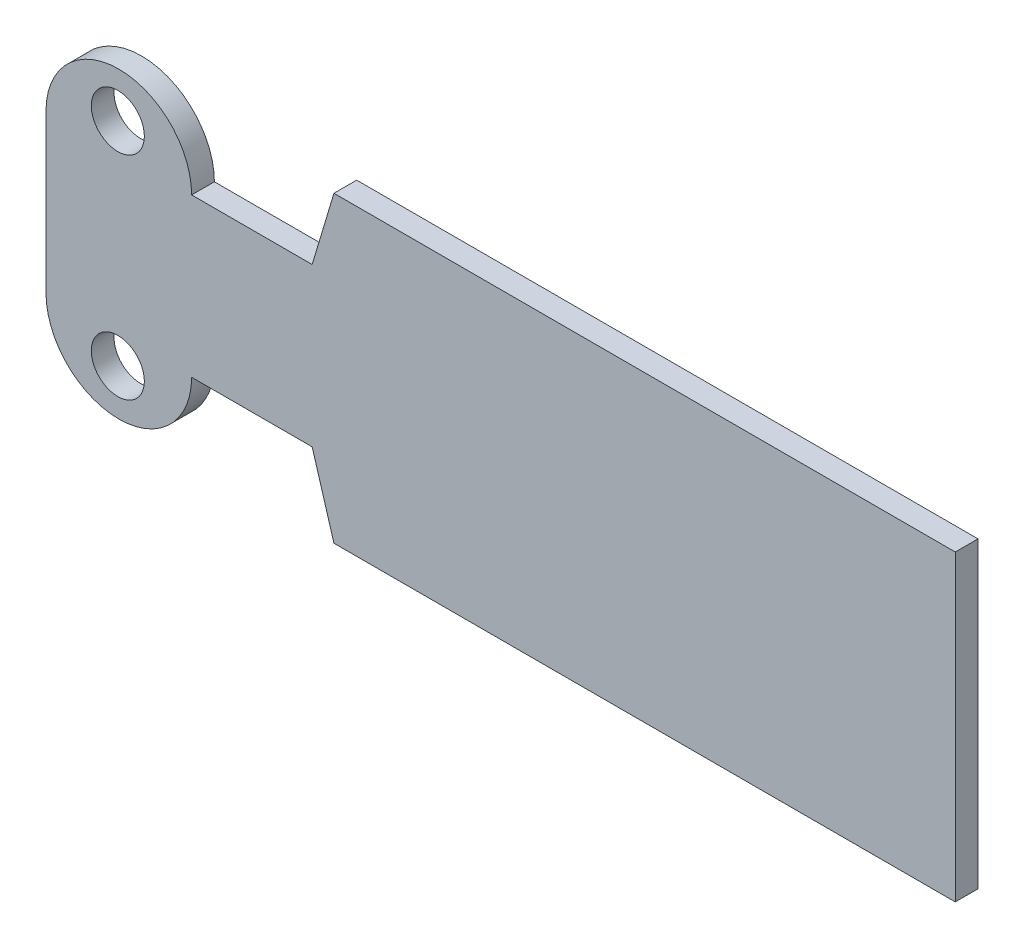
ISO-10303-21;
HEADER;
FILE_DESCRIPTION(('STEP AP214'),'2;1');
FILE_NAME('part.step','',(''),(''),'','','');
FILE_SCHEMA(('AUTOMOTIVE_DESIGN { 1 0 10303 214 1 1 1 1 }'));
ENDSEC;
DATA;
#1=APPLICATION_CONTEXT('core data for automotive mechanical design processes');
#2=APPLICATION_PROTOCOL_DEFINITION('international standard','automotive_design',2000,#1);
#3=PRODUCT_CONTEXT('',#1,'mechanical');
#4=PRODUCT('Part','Part','',(#3));
#5=PRODUCT_RELATED_PRODUCT_CATEGORY('part','',(#4));
#6=PRODUCT_DEFINITION_FORMATION('','',#4);
#7=PRODUCT_DEFINITION_CONTEXT('part definition',#1,'design');
#8=PRODUCT_DEFINITION('design','',#6,#7);
#9=PRODUCT_DEFINITION_SHAPE('','',#8);
#10=(LENGTH_UNIT() NAMED_UNIT(*) SI_UNIT(.MILLI.,.METRE.));
#11=(NAMED_UNIT(*) PLANE_ANGLE_UNIT() SI_UNIT($,.RADIAN.));
#12=(NAMED_UNIT(*) SI_UNIT($,.STERADIAN.) SOLID_ANGLE_UNIT());
#13=UNCERTAINTY_MEASURE_WITH_UNIT(LENGTH_MEASURE(1.E-05),#10,'distance_accuracy_value','');
#14=(GEOMETRIC_REPRESENTATION_CONTEXT(3) GLOBAL_UNCERTAINTY_ASSIGNED_CONTEXT((#13)) GLOBAL_UNIT_ASSIGNED_CONTEXT((#10,
#11,#12)) REPRESENTATION_CONTEXT('',''));
#15=CARTESIAN_POINT('',(0.,0.,0.));
#16=DIRECTION('',(0.,0.,1.));
#17=DIRECTION('',(1.,0.,0.));
#18=AXIS2_PLACEMENT_3D('',#15,#16,#17);
#19=CARTESIAN_POINT('',(0.,0.,1.5));
#20=DIRECTION('',(-0.957826285221151,0.287347885566345,0.));
#21=DIRECTION('',(-0.287347885566346,-0.957826285221152,0.));
#22=AXIS2_PLACEMENT_3D('',#19,#20,#21);
#23=PLANE('',#22);
#24=DIRECTION('',(0.287347885566345,0.957826285221151,0.));
#25=VECTOR('',#24,1.);
#26=CARTESIAN_POINT('',(0.,0.,0.));
#27=LINE('',#26,#25);
#28=CARTESIAN_POINT('',(1.56326057216827,5.21086857389424,0.));
#29=VERTEX_POINT('',#28);
#30=CARTESIAN_POINT('',(3.,10.,0.));
#31=VERTEX_POINT('',#30);
#32=EDGE_CURVE('E148',#29,#31,#27,.T.);
#33=ORIENTED_EDGE('',*,*,#32,.F.);
#34=DIRECTION('',(0.,0.,-1.));
#35=VECTOR('',#34,1.);
#36=CARTESIAN_POINT('',(1.56326057216827,5.21086857389424,1.5));
#37=LINE('',#36,#35);
#38=CARTESIAN_POINT('',(1.56326057216827,5.21086857389424,1.5));
#39=VERTEX_POINT('',#38);
#40=EDGE_CURVE('E11',#39,#29,#37,.T.);
#41=ORIENTED_EDGE('',*,*,#40,.F.);
#42=DIRECTION('',(0.287347885566345,0.957826285221151,0.));
#43=VECTOR('',#42,1.);
#44=CARTESIAN_POINT('',(0.,0.,1.5));
#45=LINE('',#44,#43);
#46=CARTESIAN_POINT('',(3.,10.,1.5));
#47=VERTEX_POINT('',#46);
#48=EDGE_CURVE('E179',#39,#47,#45,.T.);
#49=ORIENTED_EDGE('',*,*,#48,.T.);
#50=DIRECTION('',(0.,0.,-1.));
#51=VECTOR('',#50,1.);
#52=CARTESIAN_POINT('',(3.,10.,1.5));
#53=LINE('',#52,#51);
#54=EDGE_CURVE('E51',#47,#31,#53,.T.);
#55=ORIENTED_EDGE('',*,*,#54,.T.);
#56=EDGE_LOOP('',(#33,#41,#49,#55));
#57=FACE_BOUND('',#56,.T.);
#58=ADVANCED_FACE('F35',(#57),#23,.T.);
#59=CARTESIAN_POINT('',(0.,5.21086857389425,1.5));
#60=DIRECTION('',(0.,-1.,0.));
#61=DIRECTION('',(1.,0.,0.));
#62=AXIS2_PLACEMENT_3D('',#59,#60,#61);
#63=PLANE('',#62);
#64=DIRECTION('',(-1.,0.,0.));
#65=VECTOR('',#64,1.);
#66=CARTESIAN_POINT('',(0.,5.21086857389425,0.));
#67=LINE('',#66,#65);
#68=CARTESIAN_POINT('',(-6.3885420444181,5.21086857389427,0.));
#69=VERTEX_POINT('',#68);
#70=EDGE_CURVE('E150',#29,#69,#67,.T.);
#71=ORIENTED_EDGE('',*,*,#70,.T.);
#72=DIRECTION('',(0.,0.,-1.));
#73=VECTOR('',#72,1.);
#74=CARTESIAN_POINT('',(-6.3885420444181,5.21086857389427,1.5));
#75=LINE('',#74,#73);
#76=CARTESIAN_POINT('',(-6.3885420444181,5.21086857389427,1.5));
#77=VERTEX_POINT('',#76);
#78=EDGE_CURVE('E43',#77,#69,#75,.T.);
#79=ORIENTED_EDGE('',*,*,#78,.F.);
#80=DIRECTION('',(-1.,0.,0.));
#81=VECTOR('',#80,1.);
#82=CARTESIAN_POINT('',(0.,5.21086857389425,1.5));
#83=LINE('',#82,#81);
#84=EDGE_CURVE('E216',#39,#77,#83,.T.);
#85=ORIENTED_EDGE('',*,*,#84,.F.);
#86=ORIENTED_EDGE('',*,*,#40,.T.);
#87=EDGE_LOOP('',(#71,#79,#85,#86));
#88=FACE_BOUND('',#87,.T.);
#89=ADVANCED_FACE('F240',(#88),#63,.F.);
#90=CARTESIAN_POINT('',(-11.194271022209,5.19424226138614,1.5));
#91=DIRECTION('',(0.,0.,-1.));
#92=DIRECTION('',(-1.,0.,0.));
#93=AXIS2_PLACEMENT_3D('',#90,#91,#92);
#94=CYLINDRICAL_SURFACE('',#93,4.80575773861388);
#95=CARTESIAN_POINT('',(-11.194271022209,5.19424226138614,0.));
#96=DIRECTION('',(0.,0.,1.));
#97=DIRECTION('',(1.,0.,0.));
#98=AXIS2_PLACEMENT_3D('',#95,#96,#97);
#99=CIRCLE('',#98,4.80575773861388);
#100=CARTESIAN_POINT('',(-16.,5.21086857389426,0.));
#101=VERTEX_POINT('',#100);
#102=EDGE_CURVE('E152',#69,#101,#99,.T.);
#103=ORIENTED_EDGE('',*,*,#102,.T.);
#104=DIRECTION('',(0.,0.,-1.));
#105=VECTOR('',#104,1.);
#106=CARTESIAN_POINT('',(-16.,5.21086857389426,1.5));
#107=LINE('',#106,#105);
#108=CARTESIAN_POINT('',(-16.,5.21086857389426,1.5));
#109=VERTEX_POINT('',#108);
#110=EDGE_CURVE('E189',#109,#101,#107,.T.);
#111=ORIENTED_EDGE('',*,*,#110,.F.);
#112=CARTESIAN_POINT('',(-11.194271022209,5.19424226138614,1.5));
#113=DIRECTION('',(0.,0.,1.));
#114=DIRECTION('',(1.,0.,0.));
#115=AXIS2_PLACEMENT_3D('',#112,#113,#114);
#116=CIRCLE('',#115,4.80575773861388);
#117=EDGE_CURVE('E197',#77,#109,#116,.T.);
#118=ORIENTED_EDGE('',*,*,#117,.F.);
#119=ORIENTED_EDGE('',*,*,#78,.T.);
#120=EDGE_LOOP('',(#103,#111,#118,#119));
#121=FACE_BOUND('',#120,.T.);
#122=ADVANCED_FACE('F195',(#121),#94,.T.);
#123=CARTESIAN_POINT('',(-16.,0.,1.5));
#124=DIRECTION('',(-1.,0.,0.));
#125=DIRECTION('',(0.,-1.,0.));
#126=AXIS2_PLACEMENT_3D('',#123,#124,#125);
#127=PLANE('',#126);
#128=DIRECTION('',(0.,1.,0.));
#129=VECTOR('',#128,1.);
#130=CARTESIAN_POINT('',(-16.,0.,0.));
#131=LINE('',#130,#129);
#132=CARTESIAN_POINT('',(-16.,-5.21086857389427,0.));
#133=VERTEX_POINT('',#132);
#134=EDGE_CURVE('E155',#133,#101,#131,.T.);
#135=ORIENTED_EDGE('',*,*,#134,.F.);
#136=DIRECTION('',(0.,0.,-1.));
#137=VECTOR('',#136,1.);
#138=CARTESIAN_POINT('',(-16.,-5.21086857389427,1.5));
#139=LINE('',#138,#137);
#140=CARTESIAN_POINT('',(-16.,-5.21086857389427,1.5));
#141=VERTEX_POINT('',#140);
#142=EDGE_CURVE('E187',#141,#133,#139,.T.);
#143=ORIENTED_EDGE('',*,*,#142,.F.);
#144=DIRECTION('',(0.,1.,0.));
#145=VECTOR('',#144,1.);
#146=CARTESIAN_POINT('',(-16.,0.,1.5));
#147=LINE('',#146,#145);
#148=EDGE_CURVE('E209',#141,#109,#147,.T.);
#149=ORIENTED_EDGE('',*,*,#148,.T.);
#150=ORIENTED_EDGE('',*,*,#110,.T.);
#151=EDGE_LOOP('',(#135,#143,#149,#150));
#152=FACE_BOUND('',#151,.T.);
#153=ADVANCED_FACE('F206',(#152),#127,.T.);
#154=CARTESIAN_POINT('',(-11.194271022209,-5.19424226138614,1.5));
#155=DIRECTION('',(0.,0.,-1.));
#156=DIRECTION('',(-1.,0.,0.));
#157=AXIS2_PLACEMENT_3D('',#154,#155,#156);
#158=CYLINDRICAL_SURFACE('',#157,4.80575773861388);
#159=CARTESIAN_POINT('',(-11.194271022209,-5.19424226138614,0.));
#160=DIRECTION('',(0.,0.,1.));
#161=DIRECTION('',(1.,0.,0.));
#162=AXIS2_PLACEMENT_3D('',#159,#160,#161);
#163=CIRCLE('',#162,4.80575773861388);
#164=CARTESIAN_POINT('',(-6.3885420444181,-5.21086857389427,0.));
#165=VERTEX_POINT('',#164);
#166=EDGE_CURVE('E158',#165,#133,#163,.F.);
#167=ORIENTED_EDGE('',*,*,#166,.F.);
#168=DIRECTION('',(0.,0.,-1.));
#169=VECTOR('',#168,1.);
#170=CARTESIAN_POINT('',(-6.3885420444181,-5.21086857389427,1.5));
#171=LINE('',#170,#169);
#172=CARTESIAN_POINT('',(-6.3885420444181,-5.21086857389427,1.5));
#173=VERTEX_POINT('',#172);
#174=EDGE_CURVE('E185',#173,#165,#171,.T.);
#175=ORIENTED_EDGE('',*,*,#174,.F.);
#176=CARTESIAN_POINT('',(-11.194271022209,-5.19424226138614,1.5));
#177=DIRECTION('',(0.,0.,1.));
#178=DIRECTION('',(1.,0.,0.));
#179=AXIS2_PLACEMENT_3D('',#176,#177,#178);
#180=CIRCLE('',#179,4.80575773861388);
#181=EDGE_CURVE('E212',#173,#141,#180,.F.);
#182=ORIENTED_EDGE('',*,*,#181,.T.);
#183=ORIENTED_EDGE('',*,*,#142,.T.);
#184=EDGE_LOOP('',(#167,#175,#182,#183));
#185=FACE_BOUND('',#184,.T.);
#186=ADVANCED_FACE('F251',(#185),#158,.T.);
#187=CARTESIAN_POINT('',(0.,-5.21086857389425,1.5));
#188=DIRECTION('',(0.,-1.,0.));
#189=DIRECTION('',(1.,0.,0.));
#190=AXIS2_PLACEMENT_3D('',#187,#188,#189);
#191=PLANE('',#190);
#192=DIRECTION('',(-1.,0.,0.));
#193=VECTOR('',#192,1.);
#194=CARTESIAN_POINT('',(0.,-5.21086857389425,0.));
#195=LINE('',#194,#193);
#196=CARTESIAN_POINT('',(1.56326057216827,-5.21086857389424,0.));
#197=VERTEX_POINT('',#196);
#198=EDGE_CURVE('E161',#197,#165,#195,.T.);
#199=ORIENTED_EDGE('',*,*,#198,.F.);
#200=DIRECTION('',(0.,0.,-1.));
#201=VECTOR('',#200,1.);
#202=CARTESIAN_POINT('',(1.56326057216827,-5.21086857389424,1.5));
#203=LINE('',#202,#201);
#204=CARTESIAN_POINT('',(1.56326057216827,-5.21086857389424,1.5));
#205=VERTEX_POINT('',#204);
#206=EDGE_CURVE('E183',#205,#197,#203,.T.);
#207=ORIENTED_EDGE('',*,*,#206,.F.);
#208=DIRECTION('',(-1.,0.,0.));
#209=VECTOR('',#208,1.);
#210=CARTESIAN_POINT('',(0.,-5.21086857389425,1.5));
#211=LINE('',#210,#209);
#212=EDGE_CURVE('E214',#205,#173,#211,.T.);
#213=ORIENTED_EDGE('',*,*,#212,.T.);
#214=ORIENTED_EDGE('',*,*,#174,.T.);
#215=EDGE_LOOP('',(#199,#207,#213,#214));
#216=FACE_BOUND('',#215,.T.);
#217=ADVANCED_FACE('F254',(#216),#191,.T.);
#218=CARTESIAN_POINT('',(0.,0.,1.5));
#219=DIRECTION('',(-0.957826285221151,-0.287347885566345,0.));
#220=DIRECTION('',(0.287347885566346,-0.957826285221152,0.));
#221=AXIS2_PLACEMENT_3D('',#218,#219,#220);
#222=PLANE('',#221);
#223=DIRECTION('',(-0.287347885566345,0.957826285221151,0.));
#224=VECTOR('',#223,1.);
#225=CARTESIAN_POINT('',(0.,0.,0.));
#226=LINE('',#225,#224);
#227=CARTESIAN_POINT('',(3.,-10.,0.));
#228=VERTEX_POINT('',#227);
#229=EDGE_CURVE('E164',#228,#197,#226,.T.);
#230=ORIENTED_EDGE('',*,*,#229,.F.);
#231=DIRECTION('',(0.,0.,-1.));
#232=VECTOR('',#231,1.);
#233=CARTESIAN_POINT('',(3.,-10.,1.5));
#234=LINE('',#233,#232);
#235=CARTESIAN_POINT('',(3.,-10.,1.5));
#236=VERTEX_POINT('',#235);
#237=EDGE_CURVE('E122',#236,#228,#234,.T.);
#238=ORIENTED_EDGE('',*,*,#237,.F.);
#239=DIRECTION('',(-0.287347885566345,0.957826285221151,0.));
#240=VECTOR('',#239,1.);
#241=CARTESIAN_POINT('',(0.,0.,1.5));
#242=LINE('',#241,#240);
#243=EDGE_CURVE('E134',#236,#205,#242,.T.);
#244=ORIENTED_EDGE('',*,*,#243,.T.);
#245=ORIENTED_EDGE('',*,*,#206,.T.);
#246=EDGE_LOOP('',(#230,#238,#244,#245));
#247=FACE_BOUND('',#246,.T.);
#248=ADVANCED_FACE('F223',(#247),#222,.T.);
#249=CARTESIAN_POINT('',(0.,-10.,1.5));
#250=DIRECTION('',(0.,-1.,0.));
#251=DIRECTION('',(0.,0.,-1.));
#252=AXIS2_PLACEMENT_3D('',#249,#250,#251);
#253=PLANE('',#252);
#254=DIRECTION('',(-1.,0.,0.));
#255=VECTOR('',#254,1.);
#256=CARTESIAN_POINT('',(0.,-10.,0.));
#257=LINE('',#256,#255);
#258=CARTESIAN_POINT('',(44.,-10.,0.));
#259=VERTEX_POINT('',#258);
#260=EDGE_CURVE('E118',#259,#228,#257,.T.);
#261=ORIENTED_EDGE('',*,*,#260,.F.);
#262=DIRECTION('',(0.,0.,-1.));
#263=VECTOR('',#262,1.);
#264=CARTESIAN_POINT('',(44.,-10.,1.5));
#265=LINE('',#264,#263);
#266=CARTESIAN_POINT('',(44.,-10.,1.5));
#267=VERTEX_POINT('',#266);
#268=EDGE_CURVE('E113',#267,#259,#265,.T.);
#269=ORIENTED_EDGE('',*,*,#268,.F.);
#270=DIRECTION('',(-1.,0.,0.));
#271=VECTOR('',#270,1.);
#272=CARTESIAN_POINT('',(0.,-10.,1.5));
#273=LINE('',#272,#271);
#274=EDGE_CURVE('E116',#267,#236,#273,.T.);
#275=ORIENTED_EDGE('',*,*,#274,.T.);
#276=ORIENTED_EDGE('',*,*,#237,.T.);
#277=EDGE_LOOP('',(#261,#269,#275,#276));
#278=FACE_BOUND('',#277,.T.);
#279=ADVANCED_FACE('F115',(#278),#253,.T.);
#280=CARTESIAN_POINT('',(44.,0.,1.5));
#281=DIRECTION('',(1.,0.,0.));
#282=DIRECTION('',(0.,1.,0.));
#283=AXIS2_PLACEMENT_3D('',#280,#281,#282);
#284=PLANE('',#283);
#285=DIRECTION('',(0.,-1.,0.));
#286=VECTOR('',#285,1.);
#287=CARTESIAN_POINT('',(44.,0.,0.));
#288=LINE('',#287,#286);
#289=CARTESIAN_POINT('',(44.,10.,0.));
#290=VERTEX_POINT('',#289);
#291=EDGE_CURVE('E168',#290,#259,#288,.T.);
#292=ORIENTED_EDGE('',*,*,#291,.F.);
#293=DIRECTION('',(0.,0.,-1.));
#294=VECTOR('',#293,1.);
#295=CARTESIAN_POINT('',(44.,10.,1.5));
#296=LINE('',#295,#294);
#297=CARTESIAN_POINT('',(44.,10.,1.5));
#298=VERTEX_POINT('',#297);
#299=EDGE_CURVE('E82',#298,#290,#296,.T.);
#300=ORIENTED_EDGE('',*,*,#299,.F.);
#301=DIRECTION('',(0.,-1.,0.));
#302=VECTOR('',#301,1.);
#303=CARTESIAN_POINT('',(44.,0.,1.5));
#304=LINE('',#303,#302);
#305=EDGE_CURVE('E131',#298,#267,#304,.T.);
#306=ORIENTED_EDGE('',*,*,#305,.T.);
#307=ORIENTED_EDGE('',*,*,#268,.T.);
#308=EDGE_LOOP('',(#292,#300,#306,#307));
#309=FACE_BOUND('',#308,.T.);
#310=ADVANCED_FACE('F136',(#309),#284,.T.);
#311=CARTESIAN_POINT('',(-11.2606324684711,-7.00000000000002,1.5));
#312=DIRECTION('',(0.,0.,-1.));
#313=DIRECTION('',(-1.,0.,0.));
#314=AXIS2_PLACEMENT_3D('',#311,#312,#313);
#315=CYLINDRICAL_SURFACE('',#314,1.75);
#316=CARTESIAN_POINT('',(-11.2606324684711,-7.00000000000002,1.5));
#317=DIRECTION('',(0.,0.,1.));
#318=DIRECTION('',(1.,0.,0.));
#319=AXIS2_PLACEMENT_3D('',#316,#317,#318);
#320=CIRCLE('',#319,1.75);
#321=CARTESIAN_POINT('',(-9.51063246847112,-7.00000000000002,1.5));
#322=VERTEX_POINT('',#321);
#323=EDGE_CURVE('E139',#322,#322,#320,.T.);
#324=ORIENTED_EDGE('',*,*,#323,.T.);
#325=EDGE_LOOP('',(#324));
#326=FACE_BOUND('',#325,.T.);
#327=CARTESIAN_POINT('',(-11.2606324684711,-7.00000000000002,0.));
#328=DIRECTION('',(0.,0.,1.));
#329=DIRECTION('',(1.,0.,0.));
#330=AXIS2_PLACEMENT_3D('',#327,#328,#329);
#331=CIRCLE('',#330,1.75);
#332=CARTESIAN_POINT('',(-9.51063246847112,-7.00000000000002,0.));
#333=VERTEX_POINT('',#332);
#334=EDGE_CURVE('E173',#333,#333,#331,.T.);
#335=ORIENTED_EDGE('',*,*,#334,.F.);
#336=EDGE_LOOP('',(#335));
#337=FACE_BOUND('',#336,.T.);
#338=ADVANCED_FACE('F228',(#326,#337),#315,.F.);
#339=CARTESIAN_POINT('',(0.,10.,1.5));
#340=DIRECTION('',(0.,1.,0.));
#341=DIRECTION('',(0.,0.,1.));
#342=AXIS2_PLACEMENT_3D('',#339,#340,#341);
#343=PLANE('',#342);
#344=DIRECTION('',(1.,0.,0.));
#345=VECTOR('',#344,1.);
#346=CARTESIAN_POINT('',(0.,10.,0.));
#347=LINE('',#346,#345);
#348=EDGE_CURVE('E170',#31,#290,#347,.T.);
#349=ORIENTED_EDGE('',*,*,#348,.F.);
#350=ORIENTED_EDGE('',*,*,#54,.F.);
#351=DIRECTION('',(1.,0.,0.));
#352=VECTOR('',#351,1.);
#353=CARTESIAN_POINT('',(0.,10.,1.5));
#354=LINE('',#353,#352);
#355=EDGE_CURVE('E137',#47,#298,#354,.T.);
#356=ORIENTED_EDGE('',*,*,#355,.T.);
#357=ORIENTED_EDGE('',*,*,#299,.T.);
#358=EDGE_LOOP('',(#349,#350,#356,#357));
#359=FACE_BOUND('',#358,.T.);
#360=ADVANCED_FACE('F225',(#359),#343,.T.);
#361=CARTESIAN_POINT('',(-11.2606324684711,7.00000000000002,1.5));
#362=DIRECTION('',(0.,0.,-1.));
#363=DIRECTION('',(-1.,0.,0.));
#364=AXIS2_PLACEMENT_3D('',#361,#362,#363);
#365=CYLINDRICAL_SURFACE('',#364,1.75);
#366=CARTESIAN_POINT('',(-11.2606324684711,7.00000000000002,1.5));
#367=DIRECTION('',(0.,0.,1.));
#368=DIRECTION('',(1.,0.,0.));
#369=AXIS2_PLACEMENT_3D('',#366,#367,#368);
#370=CIRCLE('',#369,1.75);
#371=CARTESIAN_POINT('',(-9.51063246847112,7.00000000000002,1.5));
#372=VERTEX_POINT('',#371);
#373=EDGE_CURVE('E145',#372,#372,#370,.F.);
#374=ORIENTED_EDGE('',*,*,#373,.F.);
#375=EDGE_LOOP('',(#374));
#376=FACE_BOUND('',#375,.T.);
#377=CARTESIAN_POINT('',(-11.2606324684711,7.00000000000002,0.));
#378=DIRECTION('',(0.,0.,1.));
#379=DIRECTION('',(1.,0.,0.));
#380=AXIS2_PLACEMENT_3D('',#377,#378,#379);
#381=CIRCLE('',#380,1.75);
#382=CARTESIAN_POINT('',(-9.51063246847112,7.00000000000002,0.));
#383=VERTEX_POINT('',#382);
#384=EDGE_CURVE('E176',#383,#383,#381,.F.);
#385=ORIENTED_EDGE('',*,*,#384,.T.);
#386=EDGE_LOOP('',(#385));
#387=FACE_BOUND('',#386,.T.);
#388=ADVANCED_FACE('F227',(#376,#387),#365,.F.);
#389=CARTESIAN_POINT('',(0.,0.,1.5));
#390=DIRECTION('',(0.,0.,1.));
#391=DIRECTION('',(1.,0.,0.));
#392=AXIS2_PLACEMENT_3D('',#389,#390,#391);
#393=PLANE('',#392);
#394=ORIENTED_EDGE('',*,*,#48,.F.);
#395=ORIENTED_EDGE('',*,*,#84,.T.);
#396=ORIENTED_EDGE('',*,*,#117,.T.);
#397=ORIENTED_EDGE('',*,*,#148,.F.);
#398=ORIENTED_EDGE('',*,*,#181,.F.);
#399=ORIENTED_EDGE('',*,*,#212,.F.);
#400=ORIENTED_EDGE('',*,*,#243,.F.);
#401=ORIENTED_EDGE('',*,*,#274,.F.);
#402=ORIENTED_EDGE('',*,*,#305,.F.);
#403=ORIENTED_EDGE('',*,*,#355,.F.);
#404=EDGE_LOOP('',(#394,#395,#396,#397,#398,#399,#400,#401,#402,#403));
#405=FACE_BOUND('',#404,.T.);
#406=ORIENTED_EDGE('',*,*,#323,.F.);
#407=EDGE_LOOP('',(#406));
#408=FACE_BOUND('',#407,.T.);
#409=ORIENTED_EDGE('',*,*,#373,.T.);
#410=EDGE_LOOP('',(#409));
#411=FACE_BOUND('',#410,.T.);
#412=ADVANCED_FACE('F128',(#405,#408,#411),#393,.T.);
#413=CARTESIAN_POINT('',(0.,0.,0.));
#414=DIRECTION('',(0.,0.,1.));
#415=DIRECTION('',(1.,0.,0.));
#416=AXIS2_PLACEMENT_3D('',#413,#414,#415);
#417=PLANE('',#416);
#418=ORIENTED_EDGE('',*,*,#32,.T.);
#419=ORIENTED_EDGE('',*,*,#348,.T.);
#420=ORIENTED_EDGE('',*,*,#291,.T.);
#421=ORIENTED_EDGE('',*,*,#260,.T.);
#422=ORIENTED_EDGE('',*,*,#229,.T.);
#423=ORIENTED_EDGE('',*,*,#198,.T.);
#424=ORIENTED_EDGE('',*,*,#166,.T.);
#425=ORIENTED_EDGE('',*,*,#134,.T.);
#426=ORIENTED_EDGE('',*,*,#102,.F.);
#427=ORIENTED_EDGE('',*,*,#70,.F.);
#428=EDGE_LOOP('',(#418,#419,#420,#421,#422,#423,#424,#425,#426,#427));
#429=FACE_BOUND('',#428,.T.);
#430=ORIENTED_EDGE('',*,*,#334,.T.);
#431=EDGE_LOOP('',(#430));
#432=FACE_BOUND('',#431,.T.);
#433=ORIENTED_EDGE('',*,*,#384,.F.);
#434=EDGE_LOOP('',(#433));
#435=FACE_BOUND('',#434,.T.);
#436=ADVANCED_FACE('F201',(#429,#432,#435),#417,.F.);
#437=CLOSED_SHELL('',(#58,#89,#122,#153,#186,#217,#248,#279,#310,#338,#360,#388,#412,#436));
#438=MANIFOLD_SOLID_BREP('B2',#437);
#439=ADVANCED_BREP_SHAPE_REPRESENTATION('',(#18,#438),#14);
#440=SHAPE_DEFINITION_REPRESENTATION(#9,#439);
ENDSEC;
END-ISO-10303-21;
